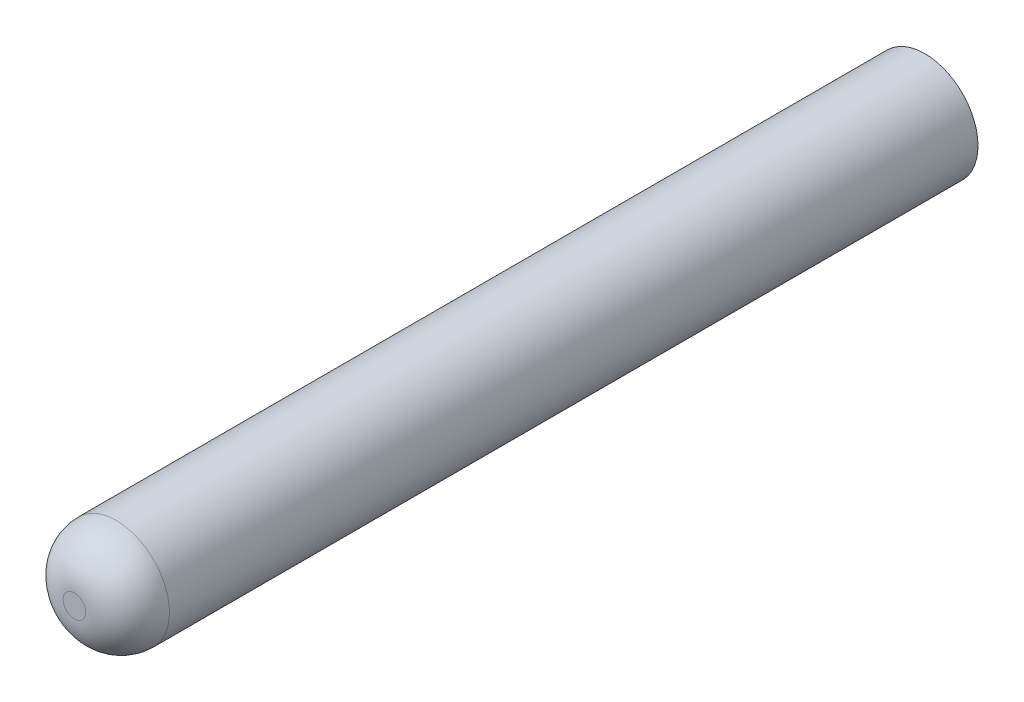
ISO-10303-21;
HEADER;
FILE_DESCRIPTION(('STEP AP214'),'2;1');
FILE_NAME('part.step','',(''),(''),'','','');
FILE_SCHEMA(('AUTOMOTIVE_DESIGN { 1 0 10303 214 1 1 1 1 }'));
ENDSEC;
DATA;
#1=APPLICATION_CONTEXT('core data for automotive mechanical design processes');
#2=APPLICATION_PROTOCOL_DEFINITION('international standard','automotive_design',2000,#1);
#3=PRODUCT_CONTEXT('',#1,'mechanical');
#4=PRODUCT('Part','Part','',(#3));
#5=PRODUCT_RELATED_PRODUCT_CATEGORY('part','',(#4));
#6=PRODUCT_DEFINITION_FORMATION('','',#4);
#7=PRODUCT_DEFINITION_CONTEXT('part definition',#1,'design');
#8=PRODUCT_DEFINITION('design','',#6,#7);
#9=PRODUCT_DEFINITION_SHAPE('','',#8);
#10=(LENGTH_UNIT() NAMED_UNIT(*) SI_UNIT(.MILLI.,.METRE.));
#11=(NAMED_UNIT(*) PLANE_ANGLE_UNIT() SI_UNIT($,.RADIAN.));
#12=(NAMED_UNIT(*) SI_UNIT($,.STERADIAN.) SOLID_ANGLE_UNIT());
#13=UNCERTAINTY_MEASURE_WITH_UNIT(LENGTH_MEASURE(1.E-05),#10,'distance_accuracy_value','');
#14=(GEOMETRIC_REPRESENTATION_CONTEXT(3) GLOBAL_UNCERTAINTY_ASSIGNED_CONTEXT((#13)) GLOBAL_UNIT_ASSIGNED_CONTEXT((#10,
#11,#12)) REPRESENTATION_CONTEXT('',''));
#15=CARTESIAN_POINT('',(0.,0.,0.));
#16=DIRECTION('',(0.,0.,1.));
#17=DIRECTION('',(1.,0.,0.));
#18=AXIS2_PLACEMENT_3D('',#15,#16,#17);
#19=CARTESIAN_POINT('',(0.,0.,203.2));
#20=DIRECTION('',(0.,0.,-1.));
#21=DIRECTION('',(-1.,0.,0.));
#22=AXIS2_PLACEMENT_3D('',#19,#20,#21);
#23=CYLINDRICAL_SURFACE('',#22,12.7);
#24=CARTESIAN_POINT('',(0.,0.,193.2));
#25=DIRECTION('',(0.,0.,1.));
#26=DIRECTION('',(1.,0.,0.));
#27=AXIS2_PLACEMENT_3D('',#24,#25,#26);
#28=CIRCLE('',#27,12.7);
#29=CARTESIAN_POINT('',(12.7,0.,193.2));
#30=VERTEX_POINT('',#29);
#31=EDGE_CURVE('E10',#30,#30,#28,.F.);
#32=ORIENTED_EDGE('',*,*,#31,.T.);
#33=EDGE_LOOP('',(#32));
#34=FACE_BOUND('',#33,.T.);
#35=CARTESIAN_POINT('',(0.,0.,0.));
#36=DIRECTION('',(0.,0.,1.));
#37=DIRECTION('',(1.,0.,0.));
#38=AXIS2_PLACEMENT_3D('',#35,#36,#37);
#39=CIRCLE('',#38,12.7);
#40=CARTESIAN_POINT('',(12.7,0.,0.));
#41=VERTEX_POINT('',#40);
#42=EDGE_CURVE('E42',#41,#41,#39,.T.);
#43=ORIENTED_EDGE('',*,*,#42,.T.);
#44=EDGE_LOOP('',(#43));
#45=FACE_BOUND('',#44,.T.);
#46=ADVANCED_FACE('F31',(#34,#45),#23,.T.);
#47=CARTESIAN_POINT('',(0.,0.,203.2));
#48=DIRECTION('',(0.,0.,1.));
#49=DIRECTION('',(1.,0.,0.));
#50=AXIS2_PLACEMENT_3D('',#47,#48,#49);
#51=PLANE('',#50);
#52=CARTESIAN_POINT('',(0.,0.,203.2));
#53=DIRECTION('',(0.,0.,1.));
#54=DIRECTION('',(1.,0.,0.));
#55=AXIS2_PLACEMENT_3D('',#52,#53,#54);
#56=CIRCLE('',#55,2.7);
#57=CARTESIAN_POINT('',(2.7,0.,203.2));
#58=VERTEX_POINT('',#57);
#59=EDGE_CURVE('E38',#58,#58,#56,.T.);
#60=ORIENTED_EDGE('',*,*,#59,.T.);
#61=EDGE_LOOP('',(#60));
#62=FACE_BOUND('',#61,.T.);
#63=ADVANCED_FACE('F52',(#62),#51,.T.);
#64=CARTESIAN_POINT('',(0.,0.,0.));
#65=DIRECTION('',(0.,0.,1.));
#66=DIRECTION('',(1.,0.,0.));
#67=AXIS2_PLACEMENT_3D('',#64,#65,#66);
#68=PLANE('',#67);
#69=ORIENTED_EDGE('',*,*,#42,.F.);
#70=EDGE_LOOP('',(#69));
#71=FACE_BOUND('',#70,.T.);
#72=ADVANCED_FACE('F50',(#71),#68,.F.);
#73=CARTESIAN_POINT('',(0.,0.,193.2));
#74=DIRECTION('',(0.,0.,1.));
#75=DIRECTION('',(1.,0.,0.));
#76=AXIS2_PLACEMENT_3D('',#73,#74,#75);
#77=DEGENERATE_TOROIDAL_SURFACE('',#76,2.7,10.,.T.);
#78=ORIENTED_EDGE('',*,*,#31,.F.);
#79=EDGE_LOOP('',(#78));
#80=FACE_BOUND('',#79,.T.);
#81=ORIENTED_EDGE('',*,*,#59,.F.);
#82=EDGE_LOOP('',(#81));
#83=FACE_BOUND('',#82,.T.);
#84=ADVANCED_FACE('F33',(#80,#83),#77,.T.);
#85=CLOSED_SHELL('',(#46,#63,#72,#84));
#86=MANIFOLD_SOLID_BREP('B2',#85);
#87=ADVANCED_BREP_SHAPE_REPRESENTATION('',(#18,#86),#14);
#88=SHAPE_DEFINITION_REPRESENTATION(#9,#87);
ENDSEC;
END-ISO-10303-21;
